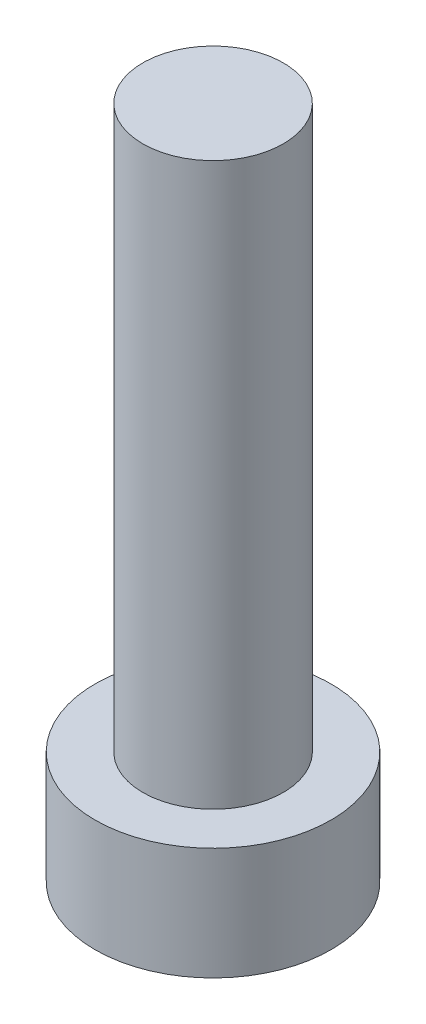
ISO-10303-21;
HEADER;
FILE_DESCRIPTION(('STEP AP214'),'2;1');
FILE_NAME('part.step','',(''),(''),'','','');
FILE_SCHEMA(('AUTOMOTIVE_DESIGN { 1 0 10303 214 1 1 1 1 }'));
ENDSEC;
DATA;
#1=APPLICATION_CONTEXT('core data for automotive mechanical design processes');
#2=APPLICATION_PROTOCOL_DEFINITION('international standard','automotive_design',2000,#1);
#3=PRODUCT_CONTEXT('',#1,'mechanical');
#4=PRODUCT('Part','Part','',(#3));
#5=PRODUCT_RELATED_PRODUCT_CATEGORY('part','',(#4));
#6=PRODUCT_DEFINITION_FORMATION('','',#4);
#7=PRODUCT_DEFINITION_CONTEXT('part definition',#1,'design');
#8=PRODUCT_DEFINITION('design','',#6,#7);
#9=PRODUCT_DEFINITION_SHAPE('','',#8);
#10=(LENGTH_UNIT() NAMED_UNIT(*) SI_UNIT(.MILLI.,.METRE.));
#11=(NAMED_UNIT(*) PLANE_ANGLE_UNIT() SI_UNIT($,.RADIAN.));
#12=(NAMED_UNIT(*) SI_UNIT($,.STERADIAN.) SOLID_ANGLE_UNIT());
#13=UNCERTAINTY_MEASURE_WITH_UNIT(LENGTH_MEASURE(1.E-05),#10,'distance_accuracy_value','');
#14=(GEOMETRIC_REPRESENTATION_CONTEXT(3) GLOBAL_UNCERTAINTY_ASSIGNED_CONTEXT((#13)) GLOBAL_UNIT_ASSIGNED_CONTEXT((#10,
#11,#12)) REPRESENTATION_CONTEXT('',''));
#15=CARTESIAN_POINT('',(0.,0.,0.));
#16=DIRECTION('',(0.,0.,1.));
#17=DIRECTION('',(1.,0.,0.));
#18=AXIS2_PLACEMENT_3D('',#15,#16,#17);
#19=CARTESIAN_POINT('',(0.,2.,0.));
#20=DIRECTION('',(0.,-1.,0.));
#21=DIRECTION('',(0.,0.,-1.));
#22=AXIS2_PLACEMENT_3D('',#19,#20,#21);
#23=CYLINDRICAL_SURFACE('',#22,2.1);
#24=CARTESIAN_POINT('',(0.,2.,0.));
#25=DIRECTION('',(0.,1.,0.));
#26=DIRECTION('',(0.,0.,1.));
#27=AXIS2_PLACEMENT_3D('',#24,#25,#26);
#28=CIRCLE('',#27,2.1);
#29=CARTESIAN_POINT('',(0.,2.,2.1));
#30=VERTEX_POINT('',#29);
#31=EDGE_CURVE('E46',#30,#30,#28,.T.);
#32=ORIENTED_EDGE('',*,*,#31,.F.);
#33=EDGE_LOOP('',(#32));
#34=FACE_BOUND('',#33,.T.);
#35=CARTESIAN_POINT('',(0.,0.,0.));
#36=DIRECTION('',(0.,1.,0.));
#37=DIRECTION('',(0.,0.,1.));
#38=AXIS2_PLACEMENT_3D('',#35,#36,#37);
#39=CIRCLE('',#38,2.1);
#40=CARTESIAN_POINT('',(0.,0.,2.1));
#41=VERTEX_POINT('',#40);
#42=EDGE_CURVE('E41',#41,#41,#39,.T.);
#43=ORIENTED_EDGE('',*,*,#42,.T.);
#44=EDGE_LOOP('',(#43));
#45=FACE_BOUND('',#44,.T.);
#46=ADVANCED_FACE('F38',(#34,#45),#23,.T.);
#47=CARTESIAN_POINT('',(0.,2.,0.));
#48=DIRECTION('',(0.,1.,0.));
#49=DIRECTION('',(0.,0.,1.));
#50=AXIS2_PLACEMENT_3D('',#47,#48,#49);
#51=PLANE('',#50);
#52=CARTESIAN_POINT('',(0.,2.,0.));
#53=DIRECTION('',(0.,1.,0.));
#54=DIRECTION('',(0.,0.,1.));
#55=AXIS2_PLACEMENT_3D('',#52,#53,#54);
#56=CIRCLE('',#55,1.25);
#57=CARTESIAN_POINT('',(0.,2.,1.25));
#58=VERTEX_POINT('',#57);
#59=EDGE_CURVE('E11',#58,#58,#56,.T.);
#60=ORIENTED_EDGE('',*,*,#59,.F.);
#61=EDGE_LOOP('',(#60));
#62=FACE_BOUND('',#61,.T.);
#63=ORIENTED_EDGE('',*,*,#31,.T.);
#64=EDGE_LOOP('',(#63));
#65=FACE_BOUND('',#64,.T.);
#66=ADVANCED_FACE('F158',(#62,#65),#51,.T.);
#67=CARTESIAN_POINT('',(0.,0.,0.));
#68=DIRECTION('',(0.,1.,0.));
#69=DIRECTION('',(0.,0.,1.));
#70=AXIS2_PLACEMENT_3D('',#67,#68,#69);
#71=PLANE('',#70);
#72=DIRECTION('',(-0.5,0.,0.866025403784438));
#73=VECTOR('',#72,1.);
#74=CARTESIAN_POINT('',(1.,0.,0.));
#75=LINE('',#74,#73);
#76=CARTESIAN_POINT('',(1.,0.,0.));
#77=VERTEX_POINT('',#76);
#78=CARTESIAN_POINT('',(0.499999999999999,0.,0.866025403784439));
#79=VERTEX_POINT('',#78);
#80=EDGE_CURVE('E128',#77,#79,#75,.T.);
#81=ORIENTED_EDGE('',*,*,#80,.F.);
#82=DIRECTION('',(0.5,0.,0.866025403784439));
#83=VECTOR('',#82,1.);
#84=CARTESIAN_POINT('',(0.5,0.,-0.866025403784439));
#85=LINE('',#84,#83);
#86=CARTESIAN_POINT('',(0.5,0.,-0.866025403784439));
#87=VERTEX_POINT('',#86);
#88=EDGE_CURVE('E54',#87,#77,#85,.T.);
#89=ORIENTED_EDGE('',*,*,#88,.F.);
#90=DIRECTION('',(1.,0.,0.));
#91=VECTOR('',#90,1.);
#92=CARTESIAN_POINT('',(-0.5,0.,-0.866025403784439));
#93=LINE('',#92,#91);
#94=CARTESIAN_POINT('',(-0.5,0.,-0.866025403784439));
#95=VERTEX_POINT('',#94);
#96=EDGE_CURVE('E137',#95,#87,#93,.T.);
#97=ORIENTED_EDGE('',*,*,#96,.F.);
#98=DIRECTION('',(0.5,0.,-0.866025403784439));
#99=VECTOR('',#98,1.);
#100=CARTESIAN_POINT('',(-1.,0.,0.));
#101=LINE('',#100,#99);
#102=CARTESIAN_POINT('',(-1.,0.,0.));
#103=VERTEX_POINT('',#102);
#104=EDGE_CURVE('E135',#103,#95,#101,.T.);
#105=ORIENTED_EDGE('',*,*,#104,.F.);
#106=DIRECTION('',(-0.5,0.,-0.866025403784439));
#107=VECTOR('',#106,1.);
#108=CARTESIAN_POINT('',(-0.5,0.,0.866025403784439));
#109=LINE('',#108,#107);
#110=CARTESIAN_POINT('',(-0.5,0.,0.866025403784439));
#111=VERTEX_POINT('',#110);
#112=EDGE_CURVE('E102',#111,#103,#109,.T.);
#113=ORIENTED_EDGE('',*,*,#112,.F.);
#114=DIRECTION('',(-1.,0.,0.));
#115=VECTOR('',#114,1.);
#116=CARTESIAN_POINT('',(0.499999999999999,0.,0.866025403784439));
#117=LINE('',#116,#115);
#118=EDGE_CURVE('E131',#79,#111,#117,.T.);
#119=ORIENTED_EDGE('',*,*,#118,.F.);
#120=EDGE_LOOP('',(#81,#89,#97,#105,#113,#119));
#121=FACE_BOUND('',#120,.T.);
#122=ORIENTED_EDGE('',*,*,#42,.F.);
#123=EDGE_LOOP('',(#122));
#124=FACE_BOUND('',#123,.T.);
#125=ADVANCED_FACE('F155',(#121,#124),#71,.F.);
#126=CARTESIAN_POINT('',(0.,12.,0.));
#127=DIRECTION('',(0.,-1.,0.));
#128=DIRECTION('',(0.,0.,-1.));
#129=AXIS2_PLACEMENT_3D('',#126,#127,#128);
#130=CYLINDRICAL_SURFACE('',#129,1.25);
#131=CARTESIAN_POINT('',(0.,12.,0.));
#132=DIRECTION('',(0.,1.,0.));
#133=DIRECTION('',(0.,0.,1.));
#134=AXIS2_PLACEMENT_3D('',#131,#132,#133);
#135=CIRCLE('',#134,1.25);
#136=CARTESIAN_POINT('',(0.,12.,1.25));
#137=VERTEX_POINT('',#136);
#138=EDGE_CURVE('E141',#137,#137,#135,.T.);
#139=ORIENTED_EDGE('',*,*,#138,.F.);
#140=EDGE_LOOP('',(#139));
#141=FACE_BOUND('',#140,.T.);
#142=ORIENTED_EDGE('',*,*,#59,.T.);
#143=EDGE_LOOP('',(#142));
#144=FACE_BOUND('',#143,.T.);
#145=ADVANCED_FACE('F157',(#141,#144),#130,.T.);
#146=CARTESIAN_POINT('',(0.,12.,0.));
#147=DIRECTION('',(0.,1.,0.));
#148=DIRECTION('',(0.,0.,1.));
#149=AXIS2_PLACEMENT_3D('',#146,#147,#148);
#150=PLANE('',#149);
#151=ORIENTED_EDGE('',*,*,#138,.T.);
#152=EDGE_LOOP('',(#151));
#153=FACE_BOUND('',#152,.T.);
#154=ADVANCED_FACE('F164',(#153),#150,.T.);
#155=CARTESIAN_POINT('',(0.5,1.5,-0.866025403784439));
#156=DIRECTION('',(0.866025403784439,0.,-0.5));
#157=DIRECTION('',(-0.5,0.,-0.866025403784439));
#158=AXIS2_PLACEMENT_3D('',#155,#156,#157);
#159=PLANE('',#158);
#160=ORIENTED_EDGE('',*,*,#88,.T.);
#161=DIRECTION('',(0.,-1.,0.));
#162=VECTOR('',#161,1.);
#163=CARTESIAN_POINT('',(1.,1.5,0.));
#164=LINE('',#163,#162);
#165=CARTESIAN_POINT('',(1.,1.5,0.));
#166=VERTEX_POINT('',#165);
#167=EDGE_CURVE('E84',#166,#77,#164,.T.);
#168=ORIENTED_EDGE('',*,*,#167,.F.);
#169=DIRECTION('',(0.5,0.,0.866025403784439));
#170=VECTOR('',#169,1.);
#171=CARTESIAN_POINT('',(0.5,1.5,-0.866025403784439));
#172=LINE('',#171,#170);
#173=CARTESIAN_POINT('',(0.5,1.5,-0.866025403784439));
#174=VERTEX_POINT('',#173);
#175=EDGE_CURVE('E139',#174,#166,#172,.T.);
#176=ORIENTED_EDGE('',*,*,#175,.F.);
#177=DIRECTION('',(0.,-1.,0.));
#178=VECTOR('',#177,1.);
#179=CARTESIAN_POINT('',(0.5,1.5,-0.866025403784439));
#180=LINE('',#179,#178);
#181=EDGE_CURVE('E62',#174,#87,#180,.T.);
#182=ORIENTED_EDGE('',*,*,#181,.T.);
#183=EDGE_LOOP('',(#160,#168,#176,#182));
#184=FACE_BOUND('',#183,.T.);
#185=ADVANCED_FACE('F196',(#184),#159,.F.);
#186=CARTESIAN_POINT('',(-0.5,1.5,-0.866025403784439));
#187=DIRECTION('',(0.,0.,-1.));
#188=DIRECTION('',(-1.,0.,0.));
#189=AXIS2_PLACEMENT_3D('',#186,#187,#188);
#190=PLANE('',#189);
#191=ORIENTED_EDGE('',*,*,#96,.T.);
#192=ORIENTED_EDGE('',*,*,#181,.F.);
#193=DIRECTION('',(1.,0.,0.));
#194=VECTOR('',#193,1.);
#195=CARTESIAN_POINT('',(-0.5,1.5,-0.866025403784439));
#196=LINE('',#195,#194);
#197=CARTESIAN_POINT('',(-0.5,1.5,-0.866025403784439));
#198=VERTEX_POINT('',#197);
#199=EDGE_CURVE('E114',#198,#174,#196,.T.);
#200=ORIENTED_EDGE('',*,*,#199,.F.);
#201=DIRECTION('',(0.,-1.,0.));
#202=VECTOR('',#201,1.);
#203=CARTESIAN_POINT('',(-0.5,1.5,-0.866025403784439));
#204=LINE('',#203,#202);
#205=EDGE_CURVE('E106',#198,#95,#204,.T.);
#206=ORIENTED_EDGE('',*,*,#205,.T.);
#207=EDGE_LOOP('',(#191,#192,#200,#206));
#208=FACE_BOUND('',#207,.T.);
#209=ADVANCED_FACE('F211',(#208),#190,.F.);
#210=CARTESIAN_POINT('',(-1.,1.5,0.));
#211=DIRECTION('',(-0.866025403784438,0.,-0.5));
#212=DIRECTION('',(-0.5,0.,0.866025403784439));
#213=AXIS2_PLACEMENT_3D('',#210,#211,#212);
#214=PLANE('',#213);
#215=ORIENTED_EDGE('',*,*,#104,.T.);
#216=ORIENTED_EDGE('',*,*,#205,.F.);
#217=DIRECTION('',(0.5,0.,-0.866025403784439));
#218=VECTOR('',#217,1.);
#219=CARTESIAN_POINT('',(-1.,1.5,0.));
#220=LINE('',#219,#218);
#221=CARTESIAN_POINT('',(-1.,1.5,0.));
#222=VERTEX_POINT('',#221);
#223=EDGE_CURVE('E110',#222,#198,#220,.T.);
#224=ORIENTED_EDGE('',*,*,#223,.F.);
#225=DIRECTION('',(0.,-1.,0.));
#226=VECTOR('',#225,1.);
#227=CARTESIAN_POINT('',(-1.,1.5,0.));
#228=LINE('',#227,#226);
#229=EDGE_CURVE('E95',#222,#103,#228,.T.);
#230=ORIENTED_EDGE('',*,*,#229,.T.);
#231=EDGE_LOOP('',(#215,#216,#224,#230));
#232=FACE_BOUND('',#231,.T.);
#233=ADVANCED_FACE('F111',(#232),#214,.F.);
#234=CARTESIAN_POINT('',(-0.5,1.5,0.866025403784439));
#235=DIRECTION('',(-0.866025403784439,0.,0.5));
#236=DIRECTION('',(0.5,0.,0.866025403784439));
#237=AXIS2_PLACEMENT_3D('',#234,#235,#236);
#238=PLANE('',#237);
#239=ORIENTED_EDGE('',*,*,#112,.T.);
#240=ORIENTED_EDGE('',*,*,#229,.F.);
#241=DIRECTION('',(-0.5,0.,-0.866025403784439));
#242=VECTOR('',#241,1.);
#243=CARTESIAN_POINT('',(-0.5,1.5,0.866025403784439));
#244=LINE('',#243,#242);
#245=CARTESIAN_POINT('',(-0.5,1.5,0.866025403784439));
#246=VERTEX_POINT('',#245);
#247=EDGE_CURVE('E99',#246,#222,#244,.T.);
#248=ORIENTED_EDGE('',*,*,#247,.F.);
#249=DIRECTION('',(0.,-1.,0.));
#250=VECTOR('',#249,1.);
#251=CARTESIAN_POINT('',(-0.5,1.5,0.866025403784439));
#252=LINE('',#251,#250);
#253=EDGE_CURVE('E107',#246,#111,#252,.T.);
#254=ORIENTED_EDGE('',*,*,#253,.T.);
#255=EDGE_LOOP('',(#239,#240,#248,#254));
#256=FACE_BOUND('',#255,.T.);
#257=ADVANCED_FACE('F97',(#256),#238,.F.);
#258=CARTESIAN_POINT('',(0.499999999999999,1.5,0.866025403784439));
#259=DIRECTION('',(0.,0.,1.));
#260=DIRECTION('',(1.,0.,0.));
#261=AXIS2_PLACEMENT_3D('',#258,#259,#260);
#262=PLANE('',#261);
#263=ORIENTED_EDGE('',*,*,#118,.T.);
#264=ORIENTED_EDGE('',*,*,#253,.F.);
#265=DIRECTION('',(-1.,0.,0.));
#266=VECTOR('',#265,1.);
#267=CARTESIAN_POINT('',(0.499999999999999,1.5,0.866025403784439));
#268=LINE('',#267,#266);
#269=CARTESIAN_POINT('',(0.499999999999999,1.5,0.866025403784439));
#270=VERTEX_POINT('',#269);
#271=EDGE_CURVE('E120',#270,#246,#268,.T.);
#272=ORIENTED_EDGE('',*,*,#271,.F.);
#273=DIRECTION('',(0.,-1.,0.));
#274=VECTOR('',#273,1.);
#275=CARTESIAN_POINT('',(0.499999999999999,1.5,0.866025403784439));
#276=LINE('',#275,#274);
#277=EDGE_CURVE('E144',#270,#79,#276,.T.);
#278=ORIENTED_EDGE('',*,*,#277,.T.);
#279=EDGE_LOOP('',(#263,#264,#272,#278));
#280=FACE_BOUND('',#279,.T.);
#281=ADVANCED_FACE('F236',(#280),#262,.F.);
#282=CARTESIAN_POINT('',(1.,1.5,0.));
#283=DIRECTION('',(0.866025403784438,0.,0.5));
#284=DIRECTION('',(0.5,0.,-0.866025403784438));
#285=AXIS2_PLACEMENT_3D('',#282,#283,#284);
#286=PLANE('',#285);
#287=ORIENTED_EDGE('',*,*,#80,.T.);
#288=ORIENTED_EDGE('',*,*,#277,.F.);
#289=DIRECTION('',(-0.5,0.,0.866025403784438));
#290=VECTOR('',#289,1.);
#291=CARTESIAN_POINT('',(1.,1.5,0.));
#292=LINE('',#291,#290);
#293=EDGE_CURVE('E122',#166,#270,#292,.T.);
#294=ORIENTED_EDGE('',*,*,#293,.F.);
#295=ORIENTED_EDGE('',*,*,#167,.T.);
#296=EDGE_LOOP('',(#287,#288,#294,#295));
#297=FACE_BOUND('',#296,.T.);
#298=ADVANCED_FACE('F245',(#297),#286,.F.);
#299=CARTESIAN_POINT('',(0.,1.5,0.));
#300=DIRECTION('',(0.,-1.,0.));
#301=DIRECTION('',(0.,0.,-1.));
#302=AXIS2_PLACEMENT_3D('',#299,#300,#301);
#303=PLANE('',#302);
#304=ORIENTED_EDGE('',*,*,#175,.T.);
#305=ORIENTED_EDGE('',*,*,#293,.T.);
#306=ORIENTED_EDGE('',*,*,#271,.T.);
#307=ORIENTED_EDGE('',*,*,#247,.T.);
#308=ORIENTED_EDGE('',*,*,#223,.T.);
#309=ORIENTED_EDGE('',*,*,#199,.T.);
#310=EDGE_LOOP('',(#304,#305,#306,#307,#308,#309));
#311=FACE_BOUND('',#310,.T.);
#312=ADVANCED_FACE('F117',(#311),#303,.T.);
#313=CLOSED_SHELL('',(#46,#66,#125,#145,#154,#185,#209,#233,#257,#281,#298,#312));
#314=MANIFOLD_SOLID_BREP('B2',#313);
#315=ADVANCED_BREP_SHAPE_REPRESENTATION('',(#18,#314),#14);
#316=SHAPE_DEFINITION_REPRESENTATION(#9,#315);
ENDSEC;
END-ISO-10303-21;
